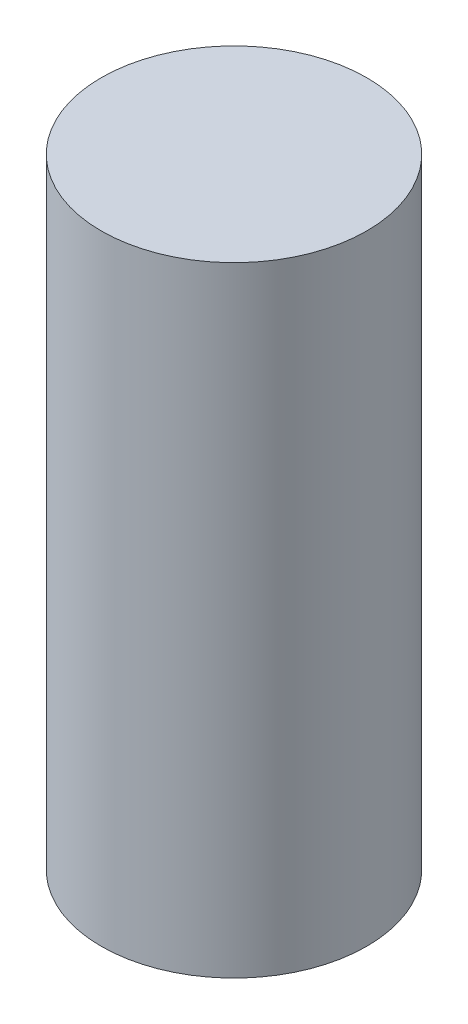
ISO-10303-21;
HEADER;
FILE_DESCRIPTION(('STEP AP214'),'2;1');
FILE_NAME('part.step','',(''),(''),'','','');
FILE_SCHEMA(('AUTOMOTIVE_DESIGN { 1 0 10303 214 1 1 1 1 }'));
ENDSEC;
DATA;
#1=APPLICATION_CONTEXT('core data for automotive mechanical design processes');
#2=APPLICATION_PROTOCOL_DEFINITION('international standard','automotive_design',2000,#1);
#3=PRODUCT_CONTEXT('',#1,'mechanical');
#4=PRODUCT('Part','Part','',(#3));
#5=PRODUCT_RELATED_PRODUCT_CATEGORY('part','',(#4));
#6=PRODUCT_DEFINITION_FORMATION('','',#4);
#7=PRODUCT_DEFINITION_CONTEXT('part definition',#1,'design');
#8=PRODUCT_DEFINITION('design','',#6,#7);
#9=PRODUCT_DEFINITION_SHAPE('','',#8);
#10=(LENGTH_UNIT() NAMED_UNIT(*) SI_UNIT(.MILLI.,.METRE.));
#11=(NAMED_UNIT(*) PLANE_ANGLE_UNIT() SI_UNIT($,.RADIAN.));
#12=(NAMED_UNIT(*) SI_UNIT($,.STERADIAN.) SOLID_ANGLE_UNIT());
#13=UNCERTAINTY_MEASURE_WITH_UNIT(LENGTH_MEASURE(1.E-05),#10,'distance_accuracy_value','');
#14=(GEOMETRIC_REPRESENTATION_CONTEXT(3) GLOBAL_UNCERTAINTY_ASSIGNED_CONTEXT((#13)) GLOBAL_UNIT_ASSIGNED_CONTEXT((#10,
#11,#12)) REPRESENTATION_CONTEXT('',''));
#15=CARTESIAN_POINT('',(0.,0.,0.));
#16=DIRECTION('',(0.,0.,1.));
#17=DIRECTION('',(1.,0.,0.));
#18=AXIS2_PLACEMENT_3D('',#15,#16,#17);
#19=CARTESIAN_POINT('',(50.,40.,-50.));
#20=DIRECTION('',(0.,-1.,0.));
#21=DIRECTION('',(0.,0.,-1.));
#22=AXIS2_PLACEMENT_3D('',#19,#20,#21);
#23=CYLINDRICAL_SURFACE('',#22,6.);
#24=CARTESIAN_POINT('',(50.,40.,-50.));
#25=DIRECTION('',(0.,1.,0.));
#26=DIRECTION('',(0.,0.,1.));
#27=AXIS2_PLACEMENT_3D('',#24,#25,#26);
#28=CIRCLE('',#27,6.);
#29=CARTESIAN_POINT('',(50.,40.,-44.));
#30=VERTEX_POINT('',#29);
#31=EDGE_CURVE('E10',#30,#30,#28,.T.);
#32=ORIENTED_EDGE('',*,*,#31,.F.);
#33=EDGE_LOOP('',(#32));
#34=FACE_BOUND('',#33,.T.);
#35=CARTESIAN_POINT('',(50.,12.,-50.));
#36=DIRECTION('',(0.,1.,0.));
#37=DIRECTION('',(0.,0.,1.));
#38=AXIS2_PLACEMENT_3D('',#35,#36,#37);
#39=CIRCLE('',#38,6.);
#40=CARTESIAN_POINT('',(50.,12.,-44.));
#41=VERTEX_POINT('',#40);
#42=EDGE_CURVE('E40',#41,#41,#39,.T.);
#43=ORIENTED_EDGE('',*,*,#42,.T.);
#44=EDGE_LOOP('',(#43));
#45=FACE_BOUND('',#44,.T.);
#46=ADVANCED_FACE('F37',(#34,#45),#23,.T.);
#47=CARTESIAN_POINT('',(50.,40.,-50.));
#48=DIRECTION('',(0.,1.,0.));
#49=DIRECTION('',(0.,0.,1.));
#50=AXIS2_PLACEMENT_3D('',#47,#48,#49);
#51=PLANE('',#50);
#52=ORIENTED_EDGE('',*,*,#31,.T.);
#53=EDGE_LOOP('',(#52));
#54=FACE_BOUND('',#53,.T.);
#55=ADVANCED_FACE('F52',(#54),#51,.T.);
#56=CARTESIAN_POINT('',(50.,12.,-50.));
#57=DIRECTION('',(0.,1.,0.));
#58=DIRECTION('',(0.,0.,1.));
#59=AXIS2_PLACEMENT_3D('',#56,#57,#58);
#60=PLANE('',#59);
#61=ORIENTED_EDGE('',*,*,#42,.F.);
#62=EDGE_LOOP('',(#61));
#63=FACE_BOUND('',#62,.T.);
#64=ADVANCED_FACE('F50',(#63),#60,.F.);
#65=CLOSED_SHELL('',(#46,#55,#64));
#66=MANIFOLD_SOLID_BREP('B2',#65);
#67=ADVANCED_BREP_SHAPE_REPRESENTATION('',(#18,#66),#14);
#68=SHAPE_DEFINITION_REPRESENTATION(#9,#67);
ENDSEC;
END-ISO-10303-21;
